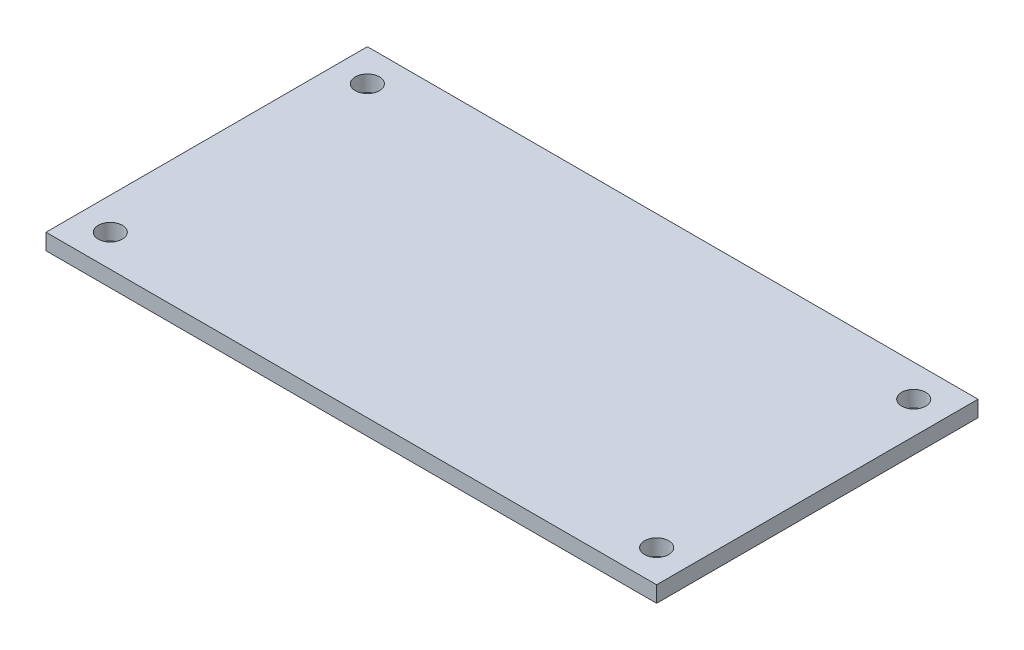
ISO-10303-21;
HEADER;
FILE_DESCRIPTION(('STEP AP214'),'2;1');
FILE_NAME('part.step','',(''),(''),'','','');
FILE_SCHEMA(('AUTOMOTIVE_DESIGN { 1 0 10303 214 1 1 1 1 }'));
ENDSEC;
DATA;
#1=APPLICATION_CONTEXT('core data for automotive mechanical design processes');
#2=APPLICATION_PROTOCOL_DEFINITION('international standard','automotive_design',2000,#1);
#3=PRODUCT_CONTEXT('',#1,'mechanical');
#4=PRODUCT('Part','Part','',(#3));
#5=PRODUCT_RELATED_PRODUCT_CATEGORY('part','',(#4));
#6=PRODUCT_DEFINITION_FORMATION('','',#4);
#7=PRODUCT_DEFINITION_CONTEXT('part definition',#1,'design');
#8=PRODUCT_DEFINITION('design','',#6,#7);
#9=PRODUCT_DEFINITION_SHAPE('','',#8);
#10=(LENGTH_UNIT() NAMED_UNIT(*) SI_UNIT(.MILLI.,.METRE.));
#11=(NAMED_UNIT(*) PLANE_ANGLE_UNIT() SI_UNIT($,.RADIAN.));
#12=(NAMED_UNIT(*) SI_UNIT($,.STERADIAN.) SOLID_ANGLE_UNIT());
#13=UNCERTAINTY_MEASURE_WITH_UNIT(LENGTH_MEASURE(1.E-05),#10,'distance_accuracy_value','');
#14=(GEOMETRIC_REPRESENTATION_CONTEXT(3) GLOBAL_UNCERTAINTY_ASSIGNED_CONTEXT((#13)) GLOBAL_UNIT_ASSIGNED_CONTEXT((#10,
#11,#12)) REPRESENTATION_CONTEXT('',''));
#15=CARTESIAN_POINT('',(0.,0.,0.));
#16=DIRECTION('',(0.,0.,1.));
#17=DIRECTION('',(1.,0.,0.));
#18=AXIS2_PLACEMENT_3D('',#15,#16,#17);
#19=CARTESIAN_POINT('',(0.,2.,0.));
#20=DIRECTION('',(0.,-1.,0.));
#21=DIRECTION('',(0.,0.,-1.));
#22=AXIS2_PLACEMENT_3D('',#19,#20,#21);
#23=PLANE('',#22);
#24=DIRECTION('',(0.,0.,1.));
#25=VECTOR('',#24,1.);
#26=CARTESIAN_POINT('',(-38.,2.,20.));
#27=LINE('',#26,#25);
#28=CARTESIAN_POINT('',(-38.,2.,-20.));
#29=VERTEX_POINT('',#28);
#30=CARTESIAN_POINT('',(-38.,2.,20.));
#31=VERTEX_POINT('',#30);
#32=EDGE_CURVE('E98',#29,#31,#27,.T.);
#33=ORIENTED_EDGE('',*,*,#32,.T.);
#34=DIRECTION('',(1.,0.,0.));
#35=VECTOR('',#34,1.);
#36=CARTESIAN_POINT('',(38.,2.,20.));
#37=LINE('',#36,#35);
#38=CARTESIAN_POINT('',(38.,2.,20.));
#39=VERTEX_POINT('',#38);
#40=EDGE_CURVE('E93',#31,#39,#37,.T.);
#41=ORIENTED_EDGE('',*,*,#40,.T.);
#42=DIRECTION('',(0.,0.,-1.));
#43=VECTOR('',#42,1.);
#44=CARTESIAN_POINT('',(38.,2.,-20.));
#45=LINE('',#44,#43);
#46=CARTESIAN_POINT('',(38.,2.,-20.));
#47=VERTEX_POINT('',#46);
#48=EDGE_CURVE('E96',#39,#47,#45,.T.);
#49=ORIENTED_EDGE('',*,*,#48,.T.);
#50=DIRECTION('',(-1.,0.,0.));
#51=VECTOR('',#50,1.);
#52=CARTESIAN_POINT('',(-38.,2.,-20.));
#53=LINE('',#52,#51);
#54=EDGE_CURVE('E63',#47,#29,#53,.T.);
#55=ORIENTED_EDGE('',*,*,#54,.T.);
#56=EDGE_LOOP('',(#33,#41,#49,#55));
#57=FACE_BOUND('',#56,.T.);
#58=CARTESIAN_POINT('',(34.,2.,-16.));
#59=DIRECTION('',(0.,1.,0.));
#60=DIRECTION('',(0.,0.,1.));
#61=AXIS2_PLACEMENT_3D('',#58,#59,#60);
#62=CIRCLE('',#61,1.5);
#63=CARTESIAN_POINT('',(34.,2.,-14.5));
#64=VERTEX_POINT('',#63);
#65=EDGE_CURVE('E118',#64,#64,#62,.T.);
#66=ORIENTED_EDGE('',*,*,#65,.F.);
#67=EDGE_LOOP('',(#66));
#68=FACE_BOUND('',#67,.T.);
#69=CARTESIAN_POINT('',(34.,2.,16.));
#70=DIRECTION('',(0.,1.,0.));
#71=DIRECTION('',(0.,0.,-1.));
#72=AXIS2_PLACEMENT_3D('',#69,#70,#71);
#73=CIRCLE('',#72,1.5);
#74=CARTESIAN_POINT('',(34.,2.,14.5));
#75=VERTEX_POINT('',#74);
#76=EDGE_CURVE('E140',#75,#75,#73,.T.);
#77=ORIENTED_EDGE('',*,*,#76,.F.);
#78=EDGE_LOOP('',(#77));
#79=FACE_BOUND('',#78,.T.);
#80=CARTESIAN_POINT('',(-34.,2.,16.));
#81=DIRECTION('',(0.,1.,0.));
#82=DIRECTION('',(0.,0.,1.));
#83=AXIS2_PLACEMENT_3D('',#80,#81,#82);
#84=CIRCLE('',#83,1.5);
#85=CARTESIAN_POINT('',(-34.,2.,17.5));
#86=VERTEX_POINT('',#85);
#87=EDGE_CURVE('E148',#86,#86,#84,.T.);
#88=ORIENTED_EDGE('',*,*,#87,.F.);
#89=EDGE_LOOP('',(#88));
#90=FACE_BOUND('',#89,.T.);
#91=CARTESIAN_POINT('',(-34.,2.,-16.));
#92=DIRECTION('',(0.,1.,0.));
#93=DIRECTION('',(0.,0.,-1.));
#94=AXIS2_PLACEMENT_3D('',#91,#92,#93);
#95=CIRCLE('',#94,1.5);
#96=CARTESIAN_POINT('',(-34.,2.,-17.5));
#97=VERTEX_POINT('',#96);
#98=EDGE_CURVE('E156',#97,#97,#95,.T.);
#99=ORIENTED_EDGE('',*,*,#98,.F.);
#100=EDGE_LOOP('',(#99));
#101=FACE_BOUND('',#100,.T.);
#102=ADVANCED_FACE('F45',(#57,#68,#79,#90,#101),#23,.F.);
#103=CARTESIAN_POINT('',(0.,0.,0.));
#104=DIRECTION('',(0.,-1.,0.));
#105=DIRECTION('',(0.,0.,-1.));
#106=AXIS2_PLACEMENT_3D('',#103,#104,#105);
#107=PLANE('',#106);
#108=CARTESIAN_POINT('',(-34.,0.,16.));
#109=DIRECTION('',(0.,1.,0.));
#110=DIRECTION('',(0.,0.,1.));
#111=AXIS2_PLACEMENT_3D('',#108,#109,#110);
#112=CIRCLE('',#111,1.5);
#113=CARTESIAN_POINT('',(-34.,0.,17.5));
#114=VERTEX_POINT('',#113);
#115=EDGE_CURVE('E152',#114,#114,#112,.T.);
#116=ORIENTED_EDGE('',*,*,#115,.T.);
#117=EDGE_LOOP('',(#116));
#118=FACE_BOUND('',#117,.T.);
#119=CARTESIAN_POINT('',(34.,0.,-16.));
#120=DIRECTION('',(0.,1.,0.));
#121=DIRECTION('',(0.,0.,1.));
#122=AXIS2_PLACEMENT_3D('',#119,#120,#121);
#123=CIRCLE('',#122,1.5);
#124=CARTESIAN_POINT('',(34.,0.,-14.5));
#125=VERTEX_POINT('',#124);
#126=EDGE_CURVE('E136',#125,#125,#123,.T.);
#127=ORIENTED_EDGE('',*,*,#126,.T.);
#128=EDGE_LOOP('',(#127));
#129=FACE_BOUND('',#128,.T.);
#130=DIRECTION('',(0.,0.,1.));
#131=VECTOR('',#130,1.);
#132=CARTESIAN_POINT('',(-38.,0.,20.));
#133=LINE('',#132,#131);
#134=CARTESIAN_POINT('',(-38.,0.,-20.));
#135=VERTEX_POINT('',#134);
#136=CARTESIAN_POINT('',(-38.,0.,20.));
#137=VERTEX_POINT('',#136);
#138=EDGE_CURVE('E114',#135,#137,#133,.T.);
#139=ORIENTED_EDGE('',*,*,#138,.F.);
#140=DIRECTION('',(-1.,0.,0.));
#141=VECTOR('',#140,1.);
#142=CARTESIAN_POINT('',(-38.,0.,-20.));
#143=LINE('',#142,#141);
#144=CARTESIAN_POINT('',(38.,0.,-20.));
#145=VERTEX_POINT('',#144);
#146=EDGE_CURVE('E86',#145,#135,#143,.T.);
#147=ORIENTED_EDGE('',*,*,#146,.F.);
#148=DIRECTION('',(0.,0.,-1.));
#149=VECTOR('',#148,1.);
#150=CARTESIAN_POINT('',(38.,0.,-20.));
#151=LINE('',#150,#149);
#152=CARTESIAN_POINT('',(38.,0.,20.));
#153=VERTEX_POINT('',#152);
#154=EDGE_CURVE('E80',#153,#145,#151,.T.);
#155=ORIENTED_EDGE('',*,*,#154,.F.);
#156=DIRECTION('',(1.,0.,0.));
#157=VECTOR('',#156,1.);
#158=CARTESIAN_POINT('',(38.,0.,20.));
#159=LINE('',#158,#157);
#160=EDGE_CURVE('E103',#137,#153,#159,.T.);
#161=ORIENTED_EDGE('',*,*,#160,.F.);
#162=EDGE_LOOP('',(#139,#147,#155,#161));
#163=FACE_BOUND('',#162,.T.);
#164=CARTESIAN_POINT('',(34.,0.,16.));
#165=DIRECTION('',(0.,1.,0.));
#166=DIRECTION('',(0.,0.,-1.));
#167=AXIS2_PLACEMENT_3D('',#164,#165,#166);
#168=CIRCLE('',#167,1.5);
#169=CARTESIAN_POINT('',(34.,0.,14.5));
#170=VERTEX_POINT('',#169);
#171=EDGE_CURVE('E144',#170,#170,#168,.T.);
#172=ORIENTED_EDGE('',*,*,#171,.T.);
#173=EDGE_LOOP('',(#172));
#174=FACE_BOUND('',#173,.T.);
#175=CARTESIAN_POINT('',(-34.,0.,-16.));
#176=DIRECTION('',(0.,1.,0.));
#177=DIRECTION('',(0.,0.,-1.));
#178=AXIS2_PLACEMENT_3D('',#175,#176,#177);
#179=CIRCLE('',#178,1.5);
#180=CARTESIAN_POINT('',(-34.,0.,-17.5));
#181=VERTEX_POINT('',#180);
#182=EDGE_CURVE('E160',#181,#181,#179,.T.);
#183=ORIENTED_EDGE('',*,*,#182,.T.);
#184=EDGE_LOOP('',(#183));
#185=FACE_BOUND('',#184,.T.);
#186=ADVANCED_FACE('F131',(#118,#129,#163,#174,#185),#107,.T.);
#187=CARTESIAN_POINT('',(-38.,2.,20.));
#188=DIRECTION('',(1.,0.,0.));
#189=DIRECTION('',(0.,0.,-1.));
#190=AXIS2_PLACEMENT_3D('',#187,#188,#189);
#191=PLANE('',#190);
#192=ORIENTED_EDGE('',*,*,#138,.T.);
#193=DIRECTION('',(0.,-1.,0.));
#194=VECTOR('',#193,1.);
#195=CARTESIAN_POINT('',(-38.,2.,20.));
#196=LINE('',#195,#194);
#197=EDGE_CURVE('E11',#31,#137,#196,.T.);
#198=ORIENTED_EDGE('',*,*,#197,.F.);
#199=ORIENTED_EDGE('',*,*,#32,.F.);
#200=DIRECTION('',(0.,-1.,0.));
#201=VECTOR('',#200,1.);
#202=CARTESIAN_POINT('',(-38.,2.,-20.));
#203=LINE('',#202,#201);
#204=EDGE_CURVE('E110',#29,#135,#203,.T.);
#205=ORIENTED_EDGE('',*,*,#204,.T.);
#206=EDGE_LOOP('',(#192,#198,#199,#205));
#207=FACE_BOUND('',#206,.T.);
#208=ADVANCED_FACE('F47',(#207),#191,.F.);
#209=CARTESIAN_POINT('',(38.,2.,20.));
#210=DIRECTION('',(0.,0.,-1.));
#211=DIRECTION('',(-1.,0.,0.));
#212=AXIS2_PLACEMENT_3D('',#209,#210,#211);
#213=PLANE('',#212);
#214=ORIENTED_EDGE('',*,*,#160,.T.);
#215=DIRECTION('',(0.,-1.,0.));
#216=VECTOR('',#215,1.);
#217=CARTESIAN_POINT('',(38.,2.,20.));
#218=LINE('',#217,#216);
#219=EDGE_CURVE('E55',#39,#153,#218,.T.);
#220=ORIENTED_EDGE('',*,*,#219,.F.);
#221=ORIENTED_EDGE('',*,*,#40,.F.);
#222=ORIENTED_EDGE('',*,*,#197,.T.);
#223=EDGE_LOOP('',(#214,#220,#221,#222));
#224=FACE_BOUND('',#223,.T.);
#225=ADVANCED_FACE('F102',(#224),#213,.F.);
#226=CARTESIAN_POINT('',(38.,2.,-20.));
#227=DIRECTION('',(-1.,0.,0.));
#228=DIRECTION('',(0.,0.,1.));
#229=AXIS2_PLACEMENT_3D('',#226,#227,#228);
#230=PLANE('',#229);
#231=ORIENTED_EDGE('',*,*,#154,.T.);
#232=DIRECTION('',(0.,-1.,0.));
#233=VECTOR('',#232,1.);
#234=CARTESIAN_POINT('',(38.,2.,-20.));
#235=LINE('',#234,#233);
#236=EDGE_CURVE('E105',#47,#145,#235,.T.);
#237=ORIENTED_EDGE('',*,*,#236,.F.);
#238=ORIENTED_EDGE('',*,*,#48,.F.);
#239=ORIENTED_EDGE('',*,*,#219,.T.);
#240=EDGE_LOOP('',(#231,#237,#238,#239));
#241=FACE_BOUND('',#240,.T.);
#242=ADVANCED_FACE('F106',(#241),#230,.F.);
#243=CARTESIAN_POINT('',(-38.,2.,-20.));
#244=DIRECTION('',(0.,0.,1.));
#245=DIRECTION('',(1.,0.,0.));
#246=AXIS2_PLACEMENT_3D('',#243,#244,#245);
#247=PLANE('',#246);
#248=ORIENTED_EDGE('',*,*,#146,.T.);
#249=ORIENTED_EDGE('',*,*,#204,.F.);
#250=ORIENTED_EDGE('',*,*,#54,.F.);
#251=ORIENTED_EDGE('',*,*,#236,.T.);
#252=EDGE_LOOP('',(#248,#249,#250,#251));
#253=FACE_BOUND('',#252,.T.);
#254=ADVANCED_FACE('F128',(#253),#247,.F.);
#255=CARTESIAN_POINT('',(34.,2.,-16.));
#256=DIRECTION('',(0.,-1.,0.));
#257=DIRECTION('',(0.,0.,-1.));
#258=AXIS2_PLACEMENT_3D('',#255,#256,#257);
#259=CYLINDRICAL_SURFACE('',#258,1.5);
#260=ORIENTED_EDGE('',*,*,#65,.T.);
#261=EDGE_LOOP('',(#260));
#262=FACE_BOUND('',#261,.T.);
#263=ORIENTED_EDGE('',*,*,#126,.F.);
#264=EDGE_LOOP('',(#263));
#265=FACE_BOUND('',#264,.T.);
#266=ADVANCED_FACE('F179',(#262,#265),#259,.F.);
#267=CARTESIAN_POINT('',(34.,2.,16.));
#268=DIRECTION('',(0.,-1.,0.));
#269=DIRECTION('',(0.,0.,-1.));
#270=AXIS2_PLACEMENT_3D('',#267,#268,#269);
#271=CYLINDRICAL_SURFACE('',#270,1.5);
#272=ORIENTED_EDGE('',*,*,#76,.T.);
#273=EDGE_LOOP('',(#272));
#274=FACE_BOUND('',#273,.T.);
#275=ORIENTED_EDGE('',*,*,#171,.F.);
#276=EDGE_LOOP('',(#275));
#277=FACE_BOUND('',#276,.T.);
#278=ADVANCED_FACE('F224',(#274,#277),#271,.F.);
#279=CARTESIAN_POINT('',(-34.,2.,16.));
#280=DIRECTION('',(0.,-1.,0.));
#281=DIRECTION('',(0.,0.,-1.));
#282=AXIS2_PLACEMENT_3D('',#279,#280,#281);
#283=CYLINDRICAL_SURFACE('',#282,1.5);
#284=ORIENTED_EDGE('',*,*,#87,.T.);
#285=EDGE_LOOP('',(#284));
#286=FACE_BOUND('',#285,.T.);
#287=ORIENTED_EDGE('',*,*,#115,.F.);
#288=EDGE_LOOP('',(#287));
#289=FACE_BOUND('',#288,.T.);
#290=ADVANCED_FACE('F232',(#286,#289),#283,.F.);
#291=CARTESIAN_POINT('',(-34.,2.,-16.));
#292=DIRECTION('',(0.,-1.,0.));
#293=DIRECTION('',(0.,0.,-1.));
#294=AXIS2_PLACEMENT_3D('',#291,#292,#293);
#295=CYLINDRICAL_SURFACE('',#294,1.5);
#296=ORIENTED_EDGE('',*,*,#98,.T.);
#297=EDGE_LOOP('',(#296));
#298=FACE_BOUND('',#297,.T.);
#299=ORIENTED_EDGE('',*,*,#182,.F.);
#300=EDGE_LOOP('',(#299));
#301=FACE_BOUND('',#300,.T.);
#302=ADVANCED_FACE('F168',(#298,#301),#295,.F.);
#303=CLOSED_SHELL('',(#102,#186,#208,#225,#242,#254,#266,#278,#290,#302));
#304=MANIFOLD_SOLID_BREP('B2',#303);
#305=ADVANCED_BREP_SHAPE_REPRESENTATION('',(#18,#304),#14);
#306=SHAPE_DEFINITION_REPRESENTATION(#9,#305);
ENDSEC;
END-ISO-10303-21;
